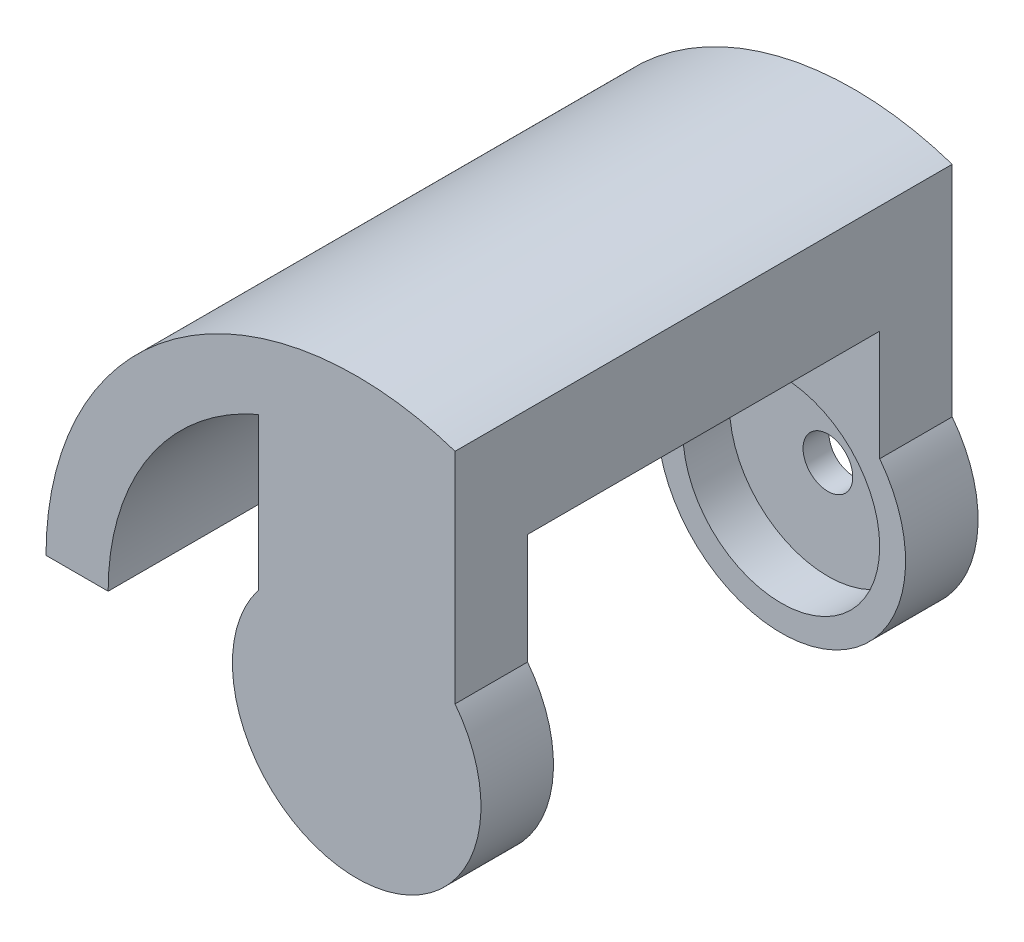
ISO-10303-21;
HEADER;
FILE_DESCRIPTION(('STEP AP214'),'2;1');
FILE_NAME('part.step','',(''),(''),'','','');
FILE_SCHEMA(('AUTOMOTIVE_DESIGN { 1 0 10303 214 1 1 1 1 }'));
ENDSEC;
DATA;
#1=APPLICATION_CONTEXT('core data for automotive mechanical design processes');
#2=APPLICATION_PROTOCOL_DEFINITION('international standard','automotive_design',2000,#1);
#3=PRODUCT_CONTEXT('',#1,'mechanical');
#4=PRODUCT('Part','Part','',(#3));
#5=PRODUCT_RELATED_PRODUCT_CATEGORY('part','',(#4));
#6=PRODUCT_DEFINITION_FORMATION('','',#4);
#7=PRODUCT_DEFINITION_CONTEXT('part definition',#1,'design');
#8=PRODUCT_DEFINITION('design','',#6,#7);
#9=PRODUCT_DEFINITION_SHAPE('','',#8);
#10=(LENGTH_UNIT() NAMED_UNIT(*) SI_UNIT(.MILLI.,.METRE.));
#11=(NAMED_UNIT(*) PLANE_ANGLE_UNIT() SI_UNIT($,.RADIAN.));
#12=(NAMED_UNIT(*) SI_UNIT($,.STERADIAN.) SOLID_ANGLE_UNIT());
#13=UNCERTAINTY_MEASURE_WITH_UNIT(LENGTH_MEASURE(1.E-05),#10,'distance_accuracy_value','');
#14=(GEOMETRIC_REPRESENTATION_CONTEXT(3) GLOBAL_UNCERTAINTY_ASSIGNED_CONTEXT((#13)) GLOBAL_UNIT_ASSIGNED_CONTEXT((#10,
#11,#12)) REPRESENTATION_CONTEXT('',''));
#15=CARTESIAN_POINT('',(0.,0.,0.));
#16=DIRECTION('',(0.,0.,1.));
#17=DIRECTION('',(1.,0.,0.));
#18=AXIS2_PLACEMENT_3D('',#15,#16,#17);
#19=CARTESIAN_POINT('',(0.,0.,-48.));
#20=DIRECTION('',(0.,0.,1.));
#21=DIRECTION('',(1.,0.,0.));
#22=AXIS2_PLACEMENT_3D('',#19,#20,#21);
#23=PLANE('',#22);
#24=CARTESIAN_POINT('',(0.,0.,-48.));
#25=DIRECTION('',(0.,0.,-1.));
#26=DIRECTION('',(-1.,0.,0.));
#27=AXIS2_PLACEMENT_3D('',#24,#25,#26);
#28=CIRCLE('',#27,2.4);
#29=CARTESIAN_POINT('',(-2.4,0.,-48.));
#30=VERTEX_POINT('',#29);
#31=EDGE_CURVE('E241',#30,#30,#28,.T.);
#32=ORIENTED_EDGE('',*,*,#31,.F.);
#33=EDGE_LOOP('',(#32));
#34=FACE_BOUND('',#33,.T.);
#35=CARTESIAN_POINT('',(0.,0.,-48.));
#36=DIRECTION('',(0.,0.,-1.));
#37=DIRECTION('',(-1.,0.,0.));
#38=AXIS2_PLACEMENT_3D('',#35,#36,#37);
#39=CIRCLE('',#38,30.);
#40=CARTESIAN_POINT('',(-30.,0.,-48.));
#41=VERTEX_POINT('',#40);
#42=CARTESIAN_POINT('',(9.5,28.4561065502644,-48.));
#43=VERTEX_POINT('',#42);
#44=EDGE_CURVE('E228',#41,#43,#39,.T.);
#45=ORIENTED_EDGE('',*,*,#44,.T.);
#46=DIRECTION('',(0.,1.,0.));
#47=VECTOR('',#46,1.);
#48=CARTESIAN_POINT('',(9.5,0.,-48.));
#49=LINE('',#48,#47);
#50=CARTESIAN_POINT('',(9.5,7.33143914930759,-48.));
#51=VERTEX_POINT('',#50);
#52=EDGE_CURVE('E191',#51,#43,#49,.T.);
#53=ORIENTED_EDGE('',*,*,#52,.F.);
#54=CARTESIAN_POINT('',(0.,0.,-48.));
#55=DIRECTION('',(0.,0.,1.));
#56=DIRECTION('',(1.,0.,0.));
#57=AXIS2_PLACEMENT_3D('',#54,#55,#56);
#58=CIRCLE('',#57,12.);
#59=CARTESIAN_POINT('',(-9.5,7.3314391493076,-48.));
#60=VERTEX_POINT('',#59);
#61=EDGE_CURVE('E265',#60,#51,#58,.T.);
#62=ORIENTED_EDGE('',*,*,#61,.F.);
#63=DIRECTION('',(0.,1.,0.));
#64=VECTOR('',#63,1.);
#65=CARTESIAN_POINT('',(-9.5,0.,-48.));
#66=LINE('',#65,#64);
#67=CARTESIAN_POINT('',(-9.5,22.0397368405342,-48.));
#68=VERTEX_POINT('',#67);
#69=EDGE_CURVE('E163',#60,#68,#66,.T.);
#70=ORIENTED_EDGE('',*,*,#69,.T.);
#71=CARTESIAN_POINT('',(0.,0.,-48.));
#72=DIRECTION('',(0.,0.,-1.));
#73=DIRECTION('',(-1.,0.,0.));
#74=AXIS2_PLACEMENT_3D('',#71,#72,#73);
#75=CIRCLE('',#74,24.);
#76=CARTESIAN_POINT('',(-24.,0.,-48.));
#77=VERTEX_POINT('',#76);
#78=EDGE_CURVE('E185',#77,#68,#75,.T.);
#79=ORIENTED_EDGE('',*,*,#78,.F.);
#80=DIRECTION('',(-1.,0.,0.));
#81=VECTOR('',#80,1.);
#82=CARTESIAN_POINT('',(0.,0.,-48.));
#83=LINE('',#82,#81);
#84=EDGE_CURVE('E171',#77,#41,#83,.T.);
#85=ORIENTED_EDGE('',*,*,#84,.T.);
#86=EDGE_LOOP('',(#45,#53,#62,#70,#79,#85));
#87=FACE_BOUND('',#86,.T.);
#88=ADVANCED_FACE('F71',(#34,#87),#23,.F.);
#89=CARTESIAN_POINT('',(0.,0.,0.));
#90=DIRECTION('',(0.,0.,1.));
#91=DIRECTION('',(1.,0.,0.));
#92=AXIS2_PLACEMENT_3D('',#89,#90,#91);
#93=PLANE('',#92);
#94=DIRECTION('',(0.,1.,0.));
#95=VECTOR('',#94,1.);
#96=CARTESIAN_POINT('',(9.5,0.,0.));
#97=LINE('',#96,#95);
#98=CARTESIAN_POINT('',(9.5,7.33143914930759,0.));
#99=VERTEX_POINT('',#98);
#100=CARTESIAN_POINT('',(9.5,28.4561065502644,0.));
#101=VERTEX_POINT('',#100);
#102=EDGE_CURVE('E187',#99,#101,#97,.T.);
#103=ORIENTED_EDGE('',*,*,#102,.T.);
#104=CARTESIAN_POINT('',(0.,0.,0.));
#105=DIRECTION('',(0.,0.,-1.));
#106=DIRECTION('',(-1.,0.,0.));
#107=AXIS2_PLACEMENT_3D('',#104,#105,#106);
#108=CIRCLE('',#107,30.);
#109=CARTESIAN_POINT('',(-30.,0.,0.));
#110=VERTEX_POINT('',#109);
#111=EDGE_CURVE('E177',#110,#101,#108,.T.);
#112=ORIENTED_EDGE('',*,*,#111,.F.);
#113=DIRECTION('',(-1.,0.,0.));
#114=VECTOR('',#113,1.);
#115=CARTESIAN_POINT('',(0.,0.,0.));
#116=LINE('',#115,#114);
#117=CARTESIAN_POINT('',(-24.,0.,0.));
#118=VERTEX_POINT('',#117);
#119=EDGE_CURVE('E169',#118,#110,#116,.T.);
#120=ORIENTED_EDGE('',*,*,#119,.F.);
#121=CARTESIAN_POINT('',(0.,0.,0.));
#122=DIRECTION('',(0.,0.,-1.));
#123=DIRECTION('',(-1.,0.,0.));
#124=AXIS2_PLACEMENT_3D('',#121,#122,#123);
#125=CIRCLE('',#124,24.);
#126=CARTESIAN_POINT('',(-9.5,22.0397368405342,0.));
#127=VERTEX_POINT('',#126);
#128=EDGE_CURVE('E151',#118,#127,#125,.T.);
#129=ORIENTED_EDGE('',*,*,#128,.T.);
#130=DIRECTION('',(0.,1.,0.));
#131=VECTOR('',#130,1.);
#132=CARTESIAN_POINT('',(-9.5,0.,0.));
#133=LINE('',#132,#131);
#134=CARTESIAN_POINT('',(-9.5,7.3314391493076,0.));
#135=VERTEX_POINT('',#134);
#136=EDGE_CURVE('E162',#135,#127,#133,.T.);
#137=ORIENTED_EDGE('',*,*,#136,.F.);
#138=CARTESIAN_POINT('',(0.,0.,0.));
#139=DIRECTION('',(0.,0.,1.));
#140=DIRECTION('',(1.,0.,0.));
#141=AXIS2_PLACEMENT_3D('',#138,#139,#140);
#142=CIRCLE('',#141,12.);
#143=EDGE_CURVE('E264',#135,#99,#142,.T.);
#144=ORIENTED_EDGE('',*,*,#143,.T.);
#145=EDGE_LOOP('',(#103,#112,#120,#129,#137,#144));
#146=FACE_BOUND('',#145,.T.);
#147=ADVANCED_FACE('F176',(#146),#93,.T.);
#148=CARTESIAN_POINT('',(12.,-12.,-7.));
#149=DIRECTION('',(0.,0.,1.));
#150=DIRECTION('',(0.,-1.,0.));
#151=AXIS2_PLACEMENT_3D('',#148,#149,#150);
#152=PLANE('',#151);
#153=CARTESIAN_POINT('',(0.,0.,-7.));
#154=DIRECTION('',(0.,0.,1.));
#155=DIRECTION('',(0.,-1.,0.));
#156=AXIS2_PLACEMENT_3D('',#153,#154,#155);
#157=CIRCLE('',#156,4.2);
#158=CARTESIAN_POINT('',(0.,-4.2,-7.));
#159=VERTEX_POINT('',#158);
#160=EDGE_CURVE('E237',#159,#159,#157,.T.);
#161=ORIENTED_EDGE('',*,*,#160,.T.);
#162=EDGE_LOOP('',(#161));
#163=FACE_BOUND('',#162,.T.);
#164=DIRECTION('',(-1.,0.,0.));
#165=VECTOR('',#164,1.);
#166=CARTESIAN_POINT('',(12.,18.,-7.));
#167=LINE('',#166,#165);
#168=CARTESIAN_POINT('',(9.5,18.,-7.));
#169=VERTEX_POINT('',#168);
#170=CARTESIAN_POINT('',(-9.5,18.,-7.));
#171=VERTEX_POINT('',#170);
#172=EDGE_CURVE('E246',#169,#171,#167,.T.);
#173=ORIENTED_EDGE('',*,*,#172,.F.);
#174=DIRECTION('',(0.,-1.,0.));
#175=VECTOR('',#174,1.);
#176=CARTESIAN_POINT('',(9.5,-12.,-7.));
#177=LINE('',#176,#175);
#178=CARTESIAN_POINT('',(9.5,7.33143914930759,-7.));
#179=VERTEX_POINT('',#178);
#180=EDGE_CURVE('E95',#169,#179,#177,.T.);
#181=ORIENTED_EDGE('',*,*,#180,.T.);
#182=CARTESIAN_POINT('',(0.,0.,-7.));
#183=DIRECTION('',(0.,0.,1.));
#184=DIRECTION('',(0.,-1.,0.));
#185=AXIS2_PLACEMENT_3D('',#182,#183,#184);
#186=CIRCLE('',#185,12.);
#187=CARTESIAN_POINT('',(-9.5,7.3314391493076,-7.));
#188=VERTEX_POINT('',#187);
#189=EDGE_CURVE('E261',#179,#188,#186,.F.);
#190=ORIENTED_EDGE('',*,*,#189,.T.);
#191=DIRECTION('',(0.,-1.,0.));
#192=VECTOR('',#191,1.);
#193=CARTESIAN_POINT('',(-9.5,-12.,-7.));
#194=LINE('',#193,#192);
#195=EDGE_CURVE('E218',#171,#188,#194,.T.);
#196=ORIENTED_EDGE('',*,*,#195,.F.);
#197=EDGE_LOOP('',(#173,#181,#190,#196));
#198=FACE_BOUND('',#197,.T.);
#199=ADVANCED_FACE('F284',(#163,#198),#152,.F.);
#200=CARTESIAN_POINT('',(12.,-12.,-41.));
#201=DIRECTION('',(0.,0.,-1.));
#202=DIRECTION('',(-1.,0.,0.));
#203=AXIS2_PLACEMENT_3D('',#200,#201,#202);
#204=PLANE('',#203);
#205=CARTESIAN_POINT('',(0.,0.,-41.));
#206=DIRECTION('',(0.,0.,-1.));
#207=DIRECTION('',(-1.,0.,0.));
#208=AXIS2_PLACEMENT_3D('',#205,#206,#207);
#209=CIRCLE('',#208,9.5);
#210=CARTESIAN_POINT('',(-9.5,0.,-41.));
#211=VERTEX_POINT('',#210);
#212=EDGE_CURVE('E254',#211,#211,#209,.F.);
#213=ORIENTED_EDGE('',*,*,#212,.F.);
#214=EDGE_LOOP('',(#213));
#215=FACE_BOUND('',#214,.T.);
#216=CARTESIAN_POINT('',(0.,0.,-41.));
#217=DIRECTION('',(0.,0.,-1.));
#218=DIRECTION('',(-1.,0.,0.));
#219=AXIS2_PLACEMENT_3D('',#216,#217,#218);
#220=CIRCLE('',#219,12.);
#221=CARTESIAN_POINT('',(-9.5,7.3314391493076,-41.));
#222=VERTEX_POINT('',#221);
#223=CARTESIAN_POINT('',(9.5,7.33143914930759,-41.));
#224=VERTEX_POINT('',#223);
#225=EDGE_CURVE('E258',#222,#224,#220,.F.);
#226=ORIENTED_EDGE('',*,*,#225,.T.);
#227=DIRECTION('',(0.,1.,0.));
#228=VECTOR('',#227,1.);
#229=CARTESIAN_POINT('',(9.5,-12.,-41.));
#230=LINE('',#229,#228);
#231=CARTESIAN_POINT('',(9.5,18.,-41.));
#232=VERTEX_POINT('',#231);
#233=EDGE_CURVE('E222',#224,#232,#230,.T.);
#234=ORIENTED_EDGE('',*,*,#233,.T.);
#235=DIRECTION('',(-1.,0.,0.));
#236=VECTOR('',#235,1.);
#237=CARTESIAN_POINT('',(12.,18.,-41.));
#238=LINE('',#237,#236);
#239=CARTESIAN_POINT('',(-9.5,18.,-41.));
#240=VERTEX_POINT('',#239);
#241=EDGE_CURVE('E250',#232,#240,#238,.T.);
#242=ORIENTED_EDGE('',*,*,#241,.T.);
#243=DIRECTION('',(0.,1.,0.));
#244=VECTOR('',#243,1.);
#245=CARTESIAN_POINT('',(-9.5,-12.,-41.));
#246=LINE('',#245,#244);
#247=EDGE_CURVE('E87',#222,#240,#246,.T.);
#248=ORIENTED_EDGE('',*,*,#247,.F.);
#249=EDGE_LOOP('',(#226,#234,#242,#248));
#250=FACE_BOUND('',#249,.T.);
#251=ADVANCED_FACE('F291',(#215,#250),#204,.F.);
#252=CARTESIAN_POINT('',(12.,18.,-7.));
#253=DIRECTION('',(0.,1.,0.));
#254=DIRECTION('',(0.,0.,1.));
#255=AXIS2_PLACEMENT_3D('',#252,#253,#254);
#256=PLANE('',#255);
#257=ORIENTED_EDGE('',*,*,#241,.F.);
#258=DIRECTION('',(0.,0.,1.));
#259=VECTOR('',#258,1.);
#260=CARTESIAN_POINT('',(9.5,18.,-7.));
#261=LINE('',#260,#259);
#262=EDGE_CURVE('E12',#232,#169,#261,.T.);
#263=ORIENTED_EDGE('',*,*,#262,.T.);
#264=ORIENTED_EDGE('',*,*,#172,.T.);
#265=DIRECTION('',(0.,0.,1.));
#266=VECTOR('',#265,1.);
#267=CARTESIAN_POINT('',(-9.5,18.,-7.));
#268=LINE('',#267,#266);
#269=EDGE_CURVE('E80',#240,#171,#268,.T.);
#270=ORIENTED_EDGE('',*,*,#269,.F.);
#271=EDGE_LOOP('',(#257,#263,#264,#270));
#272=FACE_BOUND('',#271,.T.);
#273=ADVANCED_FACE('F285',(#272),#256,.F.);
#274=CARTESIAN_POINT('',(0.,0.,-48.));
#275=DIRECTION('',(0.,0.,1.));
#276=DIRECTION('',(1.,0.,0.));
#277=AXIS2_PLACEMENT_3D('',#274,#275,#276);
#278=CYLINDRICAL_SURFACE('',#277,9.5);
#279=ORIENTED_EDGE('',*,*,#212,.T.);
#280=EDGE_LOOP('',(#279));
#281=FACE_BOUND('',#280,.T.);
#282=CARTESIAN_POINT('',(0.,0.,-45.5));
#283=DIRECTION('',(0.,0.,-1.));
#284=DIRECTION('',(-1.,0.,0.));
#285=AXIS2_PLACEMENT_3D('',#282,#283,#284);
#286=CIRCLE('',#285,9.5);
#287=CARTESIAN_POINT('',(-9.5,0.,-45.5));
#288=VERTEX_POINT('',#287);
#289=EDGE_CURVE('E268',#288,#288,#286,.F.);
#290=ORIENTED_EDGE('',*,*,#289,.F.);
#291=EDGE_LOOP('',(#290));
#292=FACE_BOUND('',#291,.T.);
#293=ADVANCED_FACE('F307',(#281,#292),#278,.F.);
#294=CARTESIAN_POINT('',(0.,0.,-48.));
#295=DIRECTION('',(0.,0.,1.));
#296=DIRECTION('',(1.,0.,0.));
#297=AXIS2_PLACEMENT_3D('',#294,#295,#296);
#298=CYLINDRICAL_SURFACE('',#297,12.);
#299=ORIENTED_EDGE('',*,*,#189,.F.);
#300=DIRECTION('',(0.,0.,-1.));
#301=VECTOR('',#300,1.);
#302=CARTESIAN_POINT('',(9.5,7.33143914930759,0.));
#303=LINE('',#302,#301);
#304=EDGE_CURVE('E200',#99,#179,#303,.T.);
#305=ORIENTED_EDGE('',*,*,#304,.F.);
#306=ORIENTED_EDGE('',*,*,#143,.F.);
#307=DIRECTION('',(0.,0.,-1.));
#308=VECTOR('',#307,1.);
#309=CARTESIAN_POINT('',(-9.5,7.3314391493076,0.));
#310=LINE('',#309,#308);
#311=EDGE_CURVE('E195',#135,#188,#310,.T.);
#312=ORIENTED_EDGE('',*,*,#311,.T.);
#313=EDGE_LOOP('',(#299,#305,#306,#312));
#314=FACE_BOUND('',#313,.T.);
#315=ADVANCED_FACE('F305',(#314),#298,.T.);
#316=ORIENTED_EDGE('',*,*,#225,.F.);
#317=EDGE_CURVE('E213',#222,#60,#310,.T.);
#318=ORIENTED_EDGE('',*,*,#317,.T.);
#319=ORIENTED_EDGE('',*,*,#61,.T.);
#320=EDGE_CURVE('E190',#224,#51,#303,.T.);
#321=ORIENTED_EDGE('',*,*,#320,.F.);
#322=EDGE_LOOP('',(#316,#318,#319,#321));
#323=FACE_BOUND('',#322,.T.);
#324=ADVANCED_FACE('F73',(#323),#298,.T.);
#325=CARTESIAN_POINT('',(0.,0.,-45.5));
#326=DIRECTION('',(0.,0.,-1.));
#327=DIRECTION('',(-1.,0.,0.));
#328=AXIS2_PLACEMENT_3D('',#325,#326,#327);
#329=PLANE('',#328);
#330=CARTESIAN_POINT('',(0.,0.,-45.5));
#331=DIRECTION('',(0.,0.,-1.));
#332=DIRECTION('',(-1.,0.,0.));
#333=AXIS2_PLACEMENT_3D('',#330,#331,#332);
#334=CIRCLE('',#333,2.4);
#335=CARTESIAN_POINT('',(-2.4,0.,-45.5));
#336=VERTEX_POINT('',#335);
#337=EDGE_CURVE('E242',#336,#336,#334,.T.);
#338=ORIENTED_EDGE('',*,*,#337,.T.);
#339=EDGE_LOOP('',(#338));
#340=FACE_BOUND('',#339,.T.);
#341=ORIENTED_EDGE('',*,*,#289,.T.);
#342=EDGE_LOOP('',(#341));
#343=FACE_BOUND('',#342,.T.);
#344=ADVANCED_FACE('F312',(#340,#343),#329,.F.);
#345=CARTESIAN_POINT('',(0.,0.,-45.5));
#346=DIRECTION('',(0.,0.,-1.));
#347=DIRECTION('',(-1.,0.,0.));
#348=AXIS2_PLACEMENT_3D('',#345,#346,#347);
#349=CYLINDRICAL_SURFACE('',#348,2.4);
#350=ORIENTED_EDGE('',*,*,#337,.F.);
#351=EDGE_LOOP('',(#350));
#352=FACE_BOUND('',#351,.T.);
#353=ORIENTED_EDGE('',*,*,#31,.T.);
#354=EDGE_LOOP('',(#353));
#355=FACE_BOUND('',#354,.T.);
#356=ADVANCED_FACE('F334',(#352,#355),#349,.F.);
#357=CARTESIAN_POINT('',(0.,0.,-11.));
#358=DIRECTION('',(0.,0.,1.));
#359=DIRECTION('',(1.,0.,0.));
#360=AXIS2_PLACEMENT_3D('',#357,#358,#359);
#361=CYLINDRICAL_SURFACE('',#360,4.2);
#362=CARTESIAN_POINT('',(0.,0.,-11.));
#363=DIRECTION('',(0.,0.,1.));
#364=DIRECTION('',(1.,0.,0.));
#365=AXIS2_PLACEMENT_3D('',#362,#363,#364);
#366=CIRCLE('',#365,4.2);
#367=CARTESIAN_POINT('',(4.2,0.,-11.));
#368=VERTEX_POINT('',#367);
#369=EDGE_CURVE('E231',#368,#368,#366,.T.);
#370=ORIENTED_EDGE('',*,*,#369,.T.);
#371=EDGE_LOOP('',(#370));
#372=FACE_BOUND('',#371,.T.);
#373=ORIENTED_EDGE('',*,*,#160,.F.);
#374=EDGE_LOOP('',(#373));
#375=FACE_BOUND('',#374,.T.);
#376=ADVANCED_FACE('F338',(#372,#375),#361,.T.);
#377=CARTESIAN_POINT('',(0.,0.,-11.));
#378=DIRECTION('',(0.,0.,1.));
#379=DIRECTION('',(1.,0.,0.));
#380=AXIS2_PLACEMENT_3D('',#377,#378,#379);
#381=PLANE('',#380);
#382=ORIENTED_EDGE('',*,*,#369,.F.);
#383=EDGE_LOOP('',(#382));
#384=FACE_BOUND('',#383,.T.);
#385=ADVANCED_FACE('F342',(#384),#381,.F.);
#386=CARTESIAN_POINT('',(0.,0.,0.));
#387=DIRECTION('',(0.,0.,-1.));
#388=DIRECTION('',(-1.,0.,0.));
#389=AXIS2_PLACEMENT_3D('',#386,#387,#388);
#390=CYLINDRICAL_SURFACE('',#389,30.);
#391=ORIENTED_EDGE('',*,*,#44,.F.);
#392=DIRECTION('',(0.,0.,-1.));
#393=VECTOR('',#392,1.);
#394=CARTESIAN_POINT('',(-30.,0.,0.));
#395=LINE('',#394,#393);
#396=EDGE_CURVE('E173',#110,#41,#395,.T.);
#397=ORIENTED_EDGE('',*,*,#396,.F.);
#398=ORIENTED_EDGE('',*,*,#111,.T.);
#399=DIRECTION('',(0.,0.,-1.));
#400=VECTOR('',#399,1.);
#401=CARTESIAN_POINT('',(9.5,28.4561065502644,0.));
#402=LINE('',#401,#400);
#403=EDGE_CURVE('E196',#101,#43,#402,.T.);
#404=ORIENTED_EDGE('',*,*,#403,.T.);
#405=EDGE_LOOP('',(#391,#397,#398,#404));
#406=FACE_BOUND('',#405,.T.);
#407=ADVANCED_FACE('F301',(#406),#390,.T.);
#408=CARTESIAN_POINT('',(9.5,0.,0.));
#409=DIRECTION('',(-1.,0.,0.));
#410=DIRECTION('',(0.,0.,1.));
#411=AXIS2_PLACEMENT_3D('',#408,#409,#410);
#412=PLANE('',#411);
#413=ORIENTED_EDGE('',*,*,#262,.F.);
#414=ORIENTED_EDGE('',*,*,#233,.F.);
#415=ORIENTED_EDGE('',*,*,#320,.T.);
#416=ORIENTED_EDGE('',*,*,#52,.T.);
#417=ORIENTED_EDGE('',*,*,#403,.F.);
#418=ORIENTED_EDGE('',*,*,#102,.F.);
#419=ORIENTED_EDGE('',*,*,#304,.T.);
#420=ORIENTED_EDGE('',*,*,#180,.F.);
#421=EDGE_LOOP('',(#413,#414,#415,#416,#417,#418,#419,#420));
#422=FACE_BOUND('',#421,.T.);
#423=ADVANCED_FACE('F287',(#422),#412,.F.);
#424=CARTESIAN_POINT('',(-9.5,0.,0.));
#425=DIRECTION('',(-1.,0.,0.));
#426=DIRECTION('',(0.,0.,1.));
#427=AXIS2_PLACEMENT_3D('',#424,#425,#426);
#428=PLANE('',#427);
#429=ORIENTED_EDGE('',*,*,#195,.T.);
#430=ORIENTED_EDGE('',*,*,#311,.F.);
#431=ORIENTED_EDGE('',*,*,#136,.T.);
#432=DIRECTION('',(0.,0.,-1.));
#433=VECTOR('',#432,1.);
#434=CARTESIAN_POINT('',(-9.5,22.0397368405342,0.));
#435=LINE('',#434,#433);
#436=EDGE_CURVE('E157',#127,#68,#435,.T.);
#437=ORIENTED_EDGE('',*,*,#436,.T.);
#438=ORIENTED_EDGE('',*,*,#69,.F.);
#439=ORIENTED_EDGE('',*,*,#317,.F.);
#440=ORIENTED_EDGE('',*,*,#247,.T.);
#441=ORIENTED_EDGE('',*,*,#269,.T.);
#442=EDGE_LOOP('',(#429,#430,#431,#437,#438,#439,#440,#441));
#443=FACE_BOUND('',#442,.T.);
#444=ADVANCED_FACE('F278',(#443),#428,.T.);
#445=CARTESIAN_POINT('',(0.,0.,0.));
#446=DIRECTION('',(0.,0.,-1.));
#447=DIRECTION('',(-1.,0.,0.));
#448=AXIS2_PLACEMENT_3D('',#445,#446,#447);
#449=CYLINDRICAL_SURFACE('',#448,24.);
#450=ORIENTED_EDGE('',*,*,#78,.T.);
#451=ORIENTED_EDGE('',*,*,#436,.F.);
#452=ORIENTED_EDGE('',*,*,#128,.F.);
#453=DIRECTION('',(0.,0.,-1.));
#454=VECTOR('',#453,1.);
#455=CARTESIAN_POINT('',(-24.,0.,0.));
#456=LINE('',#455,#454);
#457=EDGE_CURVE('E155',#118,#77,#456,.T.);
#458=ORIENTED_EDGE('',*,*,#457,.T.);
#459=EDGE_LOOP('',(#450,#451,#452,#458));
#460=FACE_BOUND('',#459,.T.);
#461=ADVANCED_FACE('F154',(#460),#449,.F.);
#462=CARTESIAN_POINT('',(0.,0.,0.));
#463=DIRECTION('',(0.,-1.,0.));
#464=DIRECTION('',(0.,0.,-1.));
#465=AXIS2_PLACEMENT_3D('',#462,#463,#464);
#466=PLANE('',#465);
#467=ORIENTED_EDGE('',*,*,#84,.F.);
#468=ORIENTED_EDGE('',*,*,#457,.F.);
#469=ORIENTED_EDGE('',*,*,#119,.T.);
#470=ORIENTED_EDGE('',*,*,#396,.T.);
#471=EDGE_LOOP('',(#467,#468,#469,#470));
#472=FACE_BOUND('',#471,.T.);
#473=ADVANCED_FACE('F167',(#472),#466,.T.);
#474=CLOSED_SHELL('',(#88,#147,#199,#251,#273,#293,#315,#324,#344,#356,#376,#385,#407,#423,#444,
#461,#473));
#475=MANIFOLD_SOLID_BREP('B2',#474);
#476=ADVANCED_BREP_SHAPE_REPRESENTATION('',(#18,#475),#14);
#477=SHAPE_DEFINITION_REPRESENTATION(#9,#476);
ENDSEC;
END-ISO-10303-21;
